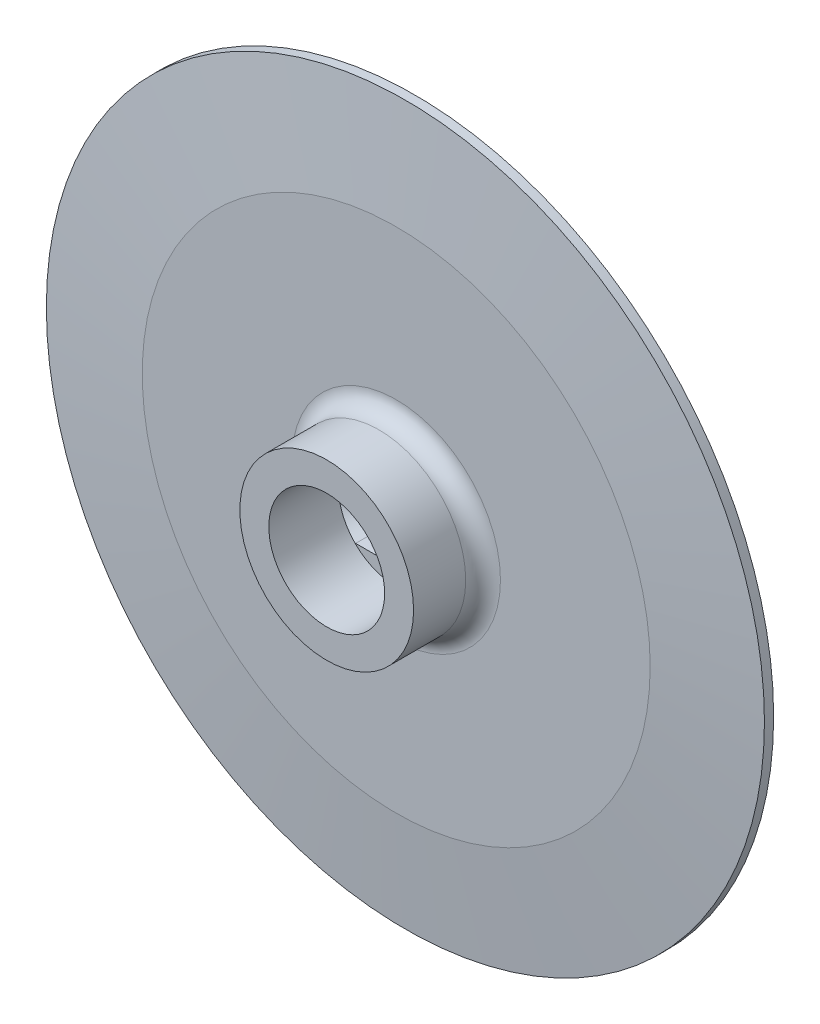
ISO-10303-21;
HEADER;
FILE_DESCRIPTION(('STEP AP214'),'2;1');
FILE_NAME('part.step','',(''),(''),'','','');
FILE_SCHEMA(('AUTOMOTIVE_DESIGN { 1 0 10303 214 1 1 1 1 }'));
ENDSEC;
DATA;
#1=APPLICATION_CONTEXT('core data for automotive mechanical design processes');
#2=APPLICATION_PROTOCOL_DEFINITION('international standard','automotive_design',2000,#1);
#3=PRODUCT_CONTEXT('',#1,'mechanical');
#4=PRODUCT('Part','Part','',(#3));
#5=PRODUCT_RELATED_PRODUCT_CATEGORY('part','',(#4));
#6=PRODUCT_DEFINITION_FORMATION('','',#4);
#7=PRODUCT_DEFINITION_CONTEXT('part definition',#1,'design');
#8=PRODUCT_DEFINITION('design','',#6,#7);
#9=PRODUCT_DEFINITION_SHAPE('','',#8);
#10=(LENGTH_UNIT() NAMED_UNIT(*) SI_UNIT(.MILLI.,.METRE.));
#11=(NAMED_UNIT(*) PLANE_ANGLE_UNIT() SI_UNIT($,.RADIAN.));
#12=(NAMED_UNIT(*) SI_UNIT($,.STERADIAN.) SOLID_ANGLE_UNIT());
#13=UNCERTAINTY_MEASURE_WITH_UNIT(LENGTH_MEASURE(1.E-05),#10,'distance_accuracy_value','');
#14=(GEOMETRIC_REPRESENTATION_CONTEXT(3) GLOBAL_UNCERTAINTY_ASSIGNED_CONTEXT((#13)) GLOBAL_UNIT_ASSIGNED_CONTEXT((#10,
#11,#12)) REPRESENTATION_CONTEXT('',''));
#15=CARTESIAN_POINT('',(0.,0.,0.));
#16=DIRECTION('',(0.,0.,1.));
#17=DIRECTION('',(1.,0.,0.));
#18=AXIS2_PLACEMENT_3D('',#15,#16,#17);
#19=CARTESIAN_POINT('',(1.75,0.,0.79375));
#20=DIRECTION('',(0.,0.,-1.));
#21=DIRECTION('',(-1.,0.,0.));
#22=AXIS2_PLACEMENT_3D('',#19,#20,#21);
#23=PLANE('',#22);
#24=CARTESIAN_POINT('',(1.75,0.,0.79375));
#25=DIRECTION('',(0.,0.,-1.));
#26=DIRECTION('',(-1.,0.,0.));
#27=AXIS2_PLACEMENT_3D('',#24,#25,#26);
#28=CIRCLE('',#27,1.75);
#29=CARTESIAN_POINT('',(1.78571428571429,1.74963553055941,0.79375));
#30=VERTEX_POINT('',#29);
#31=CARTESIAN_POINT('',(1.78571428571429,-1.74963553055941,0.79375));
#32=VERTEX_POINT('',#31);
#33=EDGE_CURVE('E108',#30,#32,#28,.T.);
#34=ORIENTED_EDGE('',*,*,#33,.T.);
#35=CARTESIAN_POINT('',(0.,0.,0.79375));
#36=DIRECTION('',(0.,0.,-1.));
#37=DIRECTION('',(-1.,0.,0.));
#38=AXIS2_PLACEMENT_3D('',#35,#36,#37);
#39=CIRCLE('',#38,2.5);
#40=EDGE_CURVE('E90',#32,#30,#39,.F.);
#41=ORIENTED_EDGE('',*,*,#40,.T.);
#42=EDGE_LOOP('',(#34,#41));
#43=FACE_BOUND('',#42,.T.);
#44=ADVANCED_FACE('F37',(#43),#23,.T.);
#45=CARTESIAN_POINT('',(0.,0.,0.396875));
#46=DIRECTION('',(0.,0.,-1.));
#47=DIRECTION('',(-1.,0.,0.));
#48=AXIS2_PLACEMENT_3D('',#45,#46,#47);
#49=CYLINDRICAL_SURFACE('',#48,15.5);
#50=CARTESIAN_POINT('',(0.,0.,0.396875));
#51=DIRECTION('',(0.,0.,1.));
#52=DIRECTION('',(1.,0.,0.));
#53=AXIS2_PLACEMENT_3D('',#50,#51,#52);
#54=CIRCLE('',#53,15.5);
#55=CARTESIAN_POINT('',(15.5,0.,0.396875));
#56=VERTEX_POINT('',#55);
#57=EDGE_CURVE('E146',#56,#56,#54,.T.);
#58=ORIENTED_EDGE('',*,*,#57,.F.);
#59=EDGE_LOOP('',(#58));
#60=FACE_BOUND('',#59,.T.);
#61=CARTESIAN_POINT('',(0.,0.,0.));
#62=DIRECTION('',(0.,0.,1.));
#63=DIRECTION('',(1.,0.,0.));
#64=AXIS2_PLACEMENT_3D('',#61,#62,#63);
#65=CIRCLE('',#64,15.5);
#66=CARTESIAN_POINT('',(15.5,0.,0.));
#67=VERTEX_POINT('',#66);
#68=EDGE_CURVE('E145',#67,#67,#65,.T.);
#69=ORIENTED_EDGE('',*,*,#68,.T.);
#70=EDGE_LOOP('',(#69));
#71=FACE_BOUND('',#70,.T.);
#72=ADVANCED_FACE('F169',(#60,#71),#49,.T.);
#73=CARTESIAN_POINT('',(0.,0.,0.));
#74=DIRECTION('',(0.,0.,1.));
#75=DIRECTION('',(1.,0.,0.));
#76=AXIS2_PLACEMENT_3D('',#73,#74,#75);
#77=PLANE('',#76);
#78=DIRECTION('',(-1.,0.,0.));
#79=VECTOR('',#78,1.);
#80=CARTESIAN_POINT('',(1.75,-1.75,0.));
#81=LINE('',#80,#79);
#82=CARTESIAN_POINT('',(1.75,-1.75,0.));
#83=VERTEX_POINT('',#82);
#84=CARTESIAN_POINT('',(-1.75,-1.75,0.));
#85=VERTEX_POINT('',#84);
#86=EDGE_CURVE('E124',#83,#85,#81,.T.);
#87=ORIENTED_EDGE('',*,*,#86,.F.);
#88=CARTESIAN_POINT('',(1.75,0.,0.));
#89=DIRECTION('',(0.,0.,-1.));
#90=DIRECTION('',(-1.,0.,0.));
#91=AXIS2_PLACEMENT_3D('',#88,#89,#90);
#92=CIRCLE('',#91,1.75);
#93=CARTESIAN_POINT('',(1.75,1.75,0.));
#94=VERTEX_POINT('',#93);
#95=EDGE_CURVE('E60',#94,#83,#92,.T.);
#96=ORIENTED_EDGE('',*,*,#95,.F.);
#97=DIRECTION('',(1.,0.,0.));
#98=VECTOR('',#97,1.);
#99=CARTESIAN_POINT('',(1.75,1.75,0.));
#100=LINE('',#99,#98);
#101=CARTESIAN_POINT('',(-1.75,1.75,0.));
#102=VERTEX_POINT('',#101);
#103=EDGE_CURVE('E111',#102,#94,#100,.T.);
#104=ORIENTED_EDGE('',*,*,#103,.F.);
#105=CARTESIAN_POINT('',(-1.75,0.,0.));
#106=DIRECTION('',(0.,0.,-1.));
#107=DIRECTION('',(-1.,0.,0.));
#108=AXIS2_PLACEMENT_3D('',#105,#106,#107);
#109=CIRCLE('',#108,1.75);
#110=EDGE_CURVE('E127',#85,#102,#109,.T.);
#111=ORIENTED_EDGE('',*,*,#110,.F.);
#112=EDGE_LOOP('',(#87,#96,#104,#111));
#113=FACE_BOUND('',#112,.T.);
#114=ORIENTED_EDGE('',*,*,#68,.F.);
#115=EDGE_LOOP('',(#114));
#116=FACE_BOUND('',#115,.T.);
#117=ADVANCED_FACE('F175',(#113,#116),#77,.F.);
#118=CARTESIAN_POINT('',(0.,0.,0.396875));
#119=DIRECTION('',(0.,0.,-1.));
#120=DIRECTION('',(1.,0.,0.));
#121=AXIS2_PLACEMENT_3D('',#118,#119,#120);
#122=CONICAL_SURFACE('',#121,15.5,1.48352986419518);
#123=CARTESIAN_POINT('',(0.,0.,0.79375));
#124=DIRECTION('',(0.,0.,1.));
#125=DIRECTION('',(1.,0.,0.));
#126=AXIS2_PLACEMENT_3D('',#123,#124,#125);
#127=CIRCLE('',#126,10.9636979923414);
#128=CARTESIAN_POINT('',(10.9636979923414,0.,0.79375));
#129=VERTEX_POINT('',#128);
#130=EDGE_CURVE('E142',#129,#129,#127,.T.);
#131=ORIENTED_EDGE('',*,*,#130,.F.);
#132=EDGE_LOOP('',(#131));
#133=FACE_BOUND('',#132,.T.);
#134=ORIENTED_EDGE('',*,*,#57,.T.);
#135=EDGE_LOOP('',(#134));
#136=FACE_BOUND('',#135,.T.);
#137=ADVANCED_FACE('F206',(#133,#136),#122,.T.);
#138=CARTESIAN_POINT('',(0.,0.,0.79375));
#139=DIRECTION('',(0.,0.,1.));
#140=DIRECTION('',(1.,0.,0.));
#141=AXIS2_PLACEMENT_3D('',#138,#139,#140);
#142=PLANE('',#141);
#143=CARTESIAN_POINT('',(0.,0.,0.79375));
#144=DIRECTION('',(0.,0.,1.));
#145=DIRECTION('',(1.,0.,0.));
#146=AXIS2_PLACEMENT_3D('',#143,#144,#145);
#147=CIRCLE('',#146,4.5);
#148=CARTESIAN_POINT('',(4.5,0.,0.79375));
#149=VERTEX_POINT('',#148);
#150=EDGE_CURVE('E11',#149,#149,#147,.F.);
#151=ORIENTED_EDGE('',*,*,#150,.T.);
#152=EDGE_LOOP('',(#151));
#153=FACE_BOUND('',#152,.T.);
#154=ORIENTED_EDGE('',*,*,#130,.T.);
#155=EDGE_LOOP('',(#154));
#156=FACE_BOUND('',#155,.T.);
#157=ADVANCED_FACE('F213',(#153,#156),#142,.T.);
#158=CARTESIAN_POINT('',(0.,0.,3.79375));
#159=DIRECTION('',(0.,0.,-1.));
#160=DIRECTION('',(-1.,0.,0.));
#161=AXIS2_PLACEMENT_3D('',#158,#159,#160);
#162=CYLINDRICAL_SURFACE('',#161,3.75);
#163=CARTESIAN_POINT('',(0.,0.,1.54375));
#164=DIRECTION('',(0.,0.,1.));
#165=DIRECTION('',(1.,0.,0.));
#166=AXIS2_PLACEMENT_3D('',#163,#164,#165);
#167=CIRCLE('',#166,3.75);
#168=CARTESIAN_POINT('',(3.75,0.,1.54375));
#169=VERTEX_POINT('',#168);
#170=EDGE_CURVE('E45',#169,#169,#167,.T.);
#171=ORIENTED_EDGE('',*,*,#170,.T.);
#172=EDGE_LOOP('',(#171));
#173=FACE_BOUND('',#172,.T.);
#174=CARTESIAN_POINT('',(0.,0.,3.79375));
#175=DIRECTION('',(0.,0.,1.));
#176=DIRECTION('',(1.,0.,0.));
#177=AXIS2_PLACEMENT_3D('',#174,#175,#176);
#178=CIRCLE('',#177,3.75);
#179=CARTESIAN_POINT('',(3.75,0.,3.79375));
#180=VERTEX_POINT('',#179);
#181=EDGE_CURVE('E134',#180,#180,#178,.T.);
#182=ORIENTED_EDGE('',*,*,#181,.F.);
#183=EDGE_LOOP('',(#182));
#184=FACE_BOUND('',#183,.T.);
#185=ADVANCED_FACE('F153',(#173,#184),#162,.T.);
#186=CARTESIAN_POINT('',(0.,0.,3.79375));
#187=DIRECTION('',(0.,0.,1.));
#188=DIRECTION('',(1.,0.,0.));
#189=AXIS2_PLACEMENT_3D('',#186,#187,#188);
#190=PLANE('',#189);
#191=CARTESIAN_POINT('',(0.,0.,3.79375));
#192=DIRECTION('',(0.,0.,1.));
#193=DIRECTION('',(1.,0.,0.));
#194=AXIS2_PLACEMENT_3D('',#191,#192,#193);
#195=CIRCLE('',#194,2.5);
#196=CARTESIAN_POINT('',(2.5,0.,3.79375));
#197=VERTEX_POINT('',#196);
#198=EDGE_CURVE('E269',#197,#197,#195,.T.);
#199=ORIENTED_EDGE('',*,*,#198,.F.);
#200=EDGE_LOOP('',(#199));
#201=FACE_BOUND('',#200,.T.);
#202=ORIENTED_EDGE('',*,*,#181,.T.);
#203=EDGE_LOOP('',(#202));
#204=FACE_BOUND('',#203,.T.);
#205=ADVANCED_FACE('F157',(#201,#204),#190,.T.);
#206=CARTESIAN_POINT('',(0.,0.,1.54375));
#207=DIRECTION('',(0.,0.,1.));
#208=DIRECTION('',(1.,0.,0.));
#209=AXIS2_PLACEMENT_3D('',#206,#207,#208);
#210=TOROIDAL_SURFACE('',#209,4.5,0.75);
#211=ORIENTED_EDGE('',*,*,#150,.F.);
#212=EDGE_LOOP('',(#211));
#213=FACE_BOUND('',#212,.T.);
#214=ORIENTED_EDGE('',*,*,#170,.F.);
#215=EDGE_LOOP('',(#214));
#216=FACE_BOUND('',#215,.T.);
#217=ADVANCED_FACE('F39',(#213,#216),#210,.F.);
#218=CARTESIAN_POINT('',(1.75,0.,0.79375));
#219=DIRECTION('',(0.,0.,-1.));
#220=DIRECTION('',(-1.,0.,0.));
#221=AXIS2_PLACEMENT_3D('',#218,#219,#220);
#222=CYLINDRICAL_SURFACE('',#221,1.75);
#223=ORIENTED_EDGE('',*,*,#95,.T.);
#224=DIRECTION('',(0.,0.,-1.));
#225=VECTOR('',#224,1.);
#226=CARTESIAN_POINT('',(1.75,-1.75,0.79375));
#227=LINE('',#226,#225);
#228=CARTESIAN_POINT('',(1.75,-1.75,0.79375));
#229=VERTEX_POINT('',#228);
#230=EDGE_CURVE('E109',#229,#83,#227,.T.);
#231=ORIENTED_EDGE('',*,*,#230,.F.);
#232=EDGE_CURVE('E101',#32,#229,#28,.T.);
#233=ORIENTED_EDGE('',*,*,#232,.F.);
#234=ORIENTED_EDGE('',*,*,#33,.F.);
#235=CARTESIAN_POINT('',(1.75,1.75,0.79375));
#236=VERTEX_POINT('',#235);
#237=EDGE_CURVE('E113',#236,#30,#28,.T.);
#238=ORIENTED_EDGE('',*,*,#237,.F.);
#239=DIRECTION('',(0.,0.,-1.));
#240=VECTOR('',#239,1.);
#241=CARTESIAN_POINT('',(1.75,1.75,0.79375));
#242=LINE('',#241,#240);
#243=EDGE_CURVE('E132',#236,#94,#242,.T.);
#244=ORIENTED_EDGE('',*,*,#243,.T.);
#245=EDGE_LOOP('',(#223,#231,#233,#234,#238,#244));
#246=FACE_BOUND('',#245,.T.);
#247=ADVANCED_FACE('F106',(#246),#222,.F.);
#248=CARTESIAN_POINT('',(1.75,1.75,0.79375));
#249=DIRECTION('',(0.,1.,0.));
#250=DIRECTION('',(-1.,0.,0.));
#251=AXIS2_PLACEMENT_3D('',#248,#249,#250);
#252=PLANE('',#251);
#253=ORIENTED_EDGE('',*,*,#103,.T.);
#254=ORIENTED_EDGE('',*,*,#243,.F.);
#255=DIRECTION('',(1.,0.,0.));
#256=VECTOR('',#255,1.);
#257=CARTESIAN_POINT('',(1.75,1.75,0.79375));
#258=LINE('',#257,#256);
#259=CARTESIAN_POINT('',(-1.75,1.75,0.79375));
#260=VERTEX_POINT('',#259);
#261=EDGE_CURVE('E120',#260,#236,#258,.T.);
#262=ORIENTED_EDGE('',*,*,#261,.F.);
#263=DIRECTION('',(0.,0.,-1.));
#264=VECTOR('',#263,1.);
#265=CARTESIAN_POINT('',(-1.75,1.75,0.79375));
#266=LINE('',#265,#264);
#267=EDGE_CURVE('E135',#260,#102,#266,.T.);
#268=ORIENTED_EDGE('',*,*,#267,.T.);
#269=EDGE_LOOP('',(#253,#254,#262,#268));
#270=FACE_BOUND('',#269,.T.);
#271=ADVANCED_FACE('F163',(#270),#252,.F.);
#272=CARTESIAN_POINT('',(-1.75,0.,0.79375));
#273=DIRECTION('',(0.,0.,-1.));
#274=DIRECTION('',(-1.,0.,0.));
#275=AXIS2_PLACEMENT_3D('',#272,#273,#274);
#276=CYLINDRICAL_SURFACE('',#275,1.75);
#277=ORIENTED_EDGE('',*,*,#110,.T.);
#278=ORIENTED_EDGE('',*,*,#267,.F.);
#279=CARTESIAN_POINT('',(-1.75,0.,0.79375));
#280=DIRECTION('',(0.,0.,-1.));
#281=DIRECTION('',(-1.,0.,0.));
#282=AXIS2_PLACEMENT_3D('',#279,#280,#281);
#283=CIRCLE('',#282,1.75);
#284=CARTESIAN_POINT('',(-1.78571428571429,1.74963553055941,0.79375));
#285=VERTEX_POINT('',#284);
#286=EDGE_CURVE('E118',#285,#260,#283,.T.);
#287=ORIENTED_EDGE('',*,*,#286,.F.);
#288=CARTESIAN_POINT('',(-1.78571428571429,-1.74963553055941,0.79375));
#289=VERTEX_POINT('',#288);
#290=EDGE_CURVE('E121',#289,#285,#283,.T.);
#291=ORIENTED_EDGE('',*,*,#290,.F.);
#292=CARTESIAN_POINT('',(-1.75,-1.75,0.79375));
#293=VERTEX_POINT('',#292);
#294=EDGE_CURVE('E103',#293,#289,#283,.T.);
#295=ORIENTED_EDGE('',*,*,#294,.F.);
#296=DIRECTION('',(0.,0.,-1.));
#297=VECTOR('',#296,1.);
#298=CARTESIAN_POINT('',(-1.75,-1.75,0.79375));
#299=LINE('',#298,#297);
#300=EDGE_CURVE('E137',#293,#85,#299,.T.);
#301=ORIENTED_EDGE('',*,*,#300,.T.);
#302=EDGE_LOOP('',(#277,#278,#287,#291,#295,#301));
#303=FACE_BOUND('',#302,.T.);
#304=ADVANCED_FACE('F187',(#303),#276,.F.);
#305=CARTESIAN_POINT('',(1.75,-1.75,0.79375));
#306=DIRECTION('',(0.,-1.,0.));
#307=DIRECTION('',(1.,0.,0.));
#308=AXIS2_PLACEMENT_3D('',#305,#306,#307);
#309=PLANE('',#308);
#310=ORIENTED_EDGE('',*,*,#86,.T.);
#311=ORIENTED_EDGE('',*,*,#300,.F.);
#312=DIRECTION('',(-1.,0.,0.));
#313=VECTOR('',#312,1.);
#314=CARTESIAN_POINT('',(1.75,-1.75,0.79375));
#315=LINE('',#314,#313);
#316=EDGE_CURVE('E114',#229,#293,#315,.T.);
#317=ORIENTED_EDGE('',*,*,#316,.F.);
#318=ORIENTED_EDGE('',*,*,#230,.T.);
#319=EDGE_LOOP('',(#310,#311,#317,#318));
#320=FACE_BOUND('',#319,.T.);
#321=ADVANCED_FACE('F180',(#320),#309,.F.);
#322=ORIENTED_EDGE('',*,*,#290,.T.);
#323=EDGE_CURVE('E105',#285,#289,#39,.F.);
#324=ORIENTED_EDGE('',*,*,#323,.T.);
#325=EDGE_LOOP('',(#322,#324));
#326=FACE_BOUND('',#325,.T.);
#327=ADVANCED_FACE('F171',(#326),#23,.T.);
#328=CARTESIAN_POINT('',(1.75,0.,0.79375));
#329=DIRECTION('',(0.,0.,-1.));
#330=DIRECTION('',(-1.,0.,0.));
#331=AXIS2_PLACEMENT_3D('',#328,#329,#330);
#332=PLANE('',#331);
#333=ORIENTED_EDGE('',*,*,#232,.T.);
#334=ORIENTED_EDGE('',*,*,#316,.T.);
#335=ORIENTED_EDGE('',*,*,#294,.T.);
#336=EDGE_CURVE('E52',#289,#32,#39,.F.);
#337=ORIENTED_EDGE('',*,*,#336,.T.);
#338=EDGE_LOOP('',(#333,#334,#335,#337));
#339=FACE_BOUND('',#338,.T.);
#340=ADVANCED_FACE('F100',(#339),#332,.F.);
#341=ORIENTED_EDGE('',*,*,#237,.T.);
#342=EDGE_CURVE('E93',#30,#285,#39,.F.);
#343=ORIENTED_EDGE('',*,*,#342,.T.);
#344=ORIENTED_EDGE('',*,*,#286,.T.);
#345=ORIENTED_EDGE('',*,*,#261,.T.);
#346=EDGE_LOOP('',(#341,#343,#344,#345));
#347=FACE_BOUND('',#346,.T.);
#348=ADVANCED_FACE('F186',(#347),#332,.F.);
#349=CARTESIAN_POINT('',(0.,0.,-6.27731781186548));
#350=DIRECTION('',(0.,0.,1.));
#351=DIRECTION('',(1.,0.,0.));
#352=AXIS2_PLACEMENT_3D('',#349,#350,#351);
#353=CYLINDRICAL_SURFACE('',#352,2.5);
#354=ORIENTED_EDGE('',*,*,#198,.T.);
#355=EDGE_LOOP('',(#354));
#356=FACE_BOUND('',#355,.T.);
#357=ORIENTED_EDGE('',*,*,#336,.F.);
#358=ORIENTED_EDGE('',*,*,#323,.F.);
#359=ORIENTED_EDGE('',*,*,#342,.F.);
#360=ORIENTED_EDGE('',*,*,#40,.F.);
#361=EDGE_LOOP('',(#357,#358,#359,#360));
#362=FACE_BOUND('',#361,.T.);
#363=ADVANCED_FACE('F91',(#356,#362),#353,.F.);
#364=CLOSED_SHELL('',(#44,#72,#117,#137,#157,#185,#205,#217,#247,#271,#304,#321,#327,#340,#348,#363));
#365=MANIFOLD_SOLID_BREP('B2',#364);
#366=ADVANCED_BREP_SHAPE_REPRESENTATION('',(#18,#365),#14);
#367=SHAPE_DEFINITION_REPRESENTATION(#9,#366);
ENDSEC;
END-ISO-10303-21;
